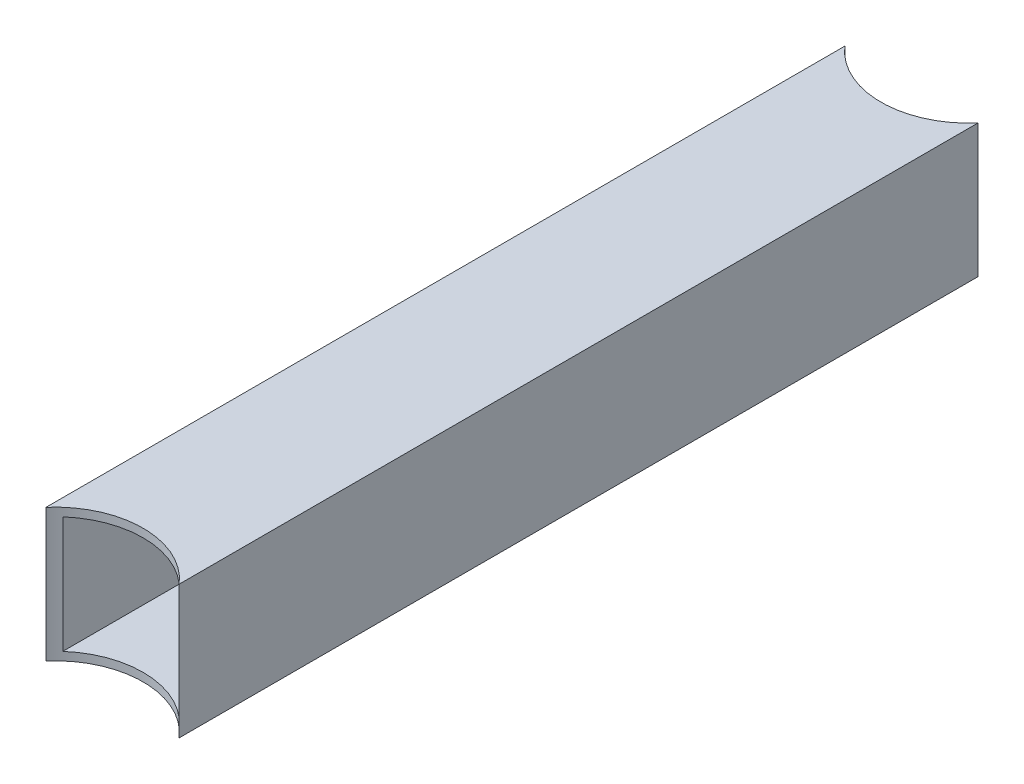
ISO-10303-21;
HEADER;
FILE_DESCRIPTION(('STEP AP214'),'2;1');
FILE_NAME('part.step','',(''),(''),'','','');
FILE_SCHEMA(('AUTOMOTIVE_DESIGN { 1 0 10303 214 1 1 1 1 }'));
ENDSEC;
DATA;
#1=APPLICATION_CONTEXT('core data for automotive mechanical design processes');
#2=APPLICATION_PROTOCOL_DEFINITION('international standard','automotive_design',2000,#1);
#3=PRODUCT_CONTEXT('',#1,'mechanical');
#4=PRODUCT('Part','Part','',(#3));
#5=PRODUCT_RELATED_PRODUCT_CATEGORY('part','',(#4));
#6=PRODUCT_DEFINITION_FORMATION('','',#4);
#7=PRODUCT_DEFINITION_CONTEXT('part definition',#1,'design');
#8=PRODUCT_DEFINITION('design','',#6,#7);
#9=PRODUCT_DEFINITION_SHAPE('','',#8);
#10=(LENGTH_UNIT() NAMED_UNIT(*) SI_UNIT(.MILLI.,.METRE.));
#11=(NAMED_UNIT(*) PLANE_ANGLE_UNIT() SI_UNIT($,.RADIAN.));
#12=(NAMED_UNIT(*) SI_UNIT($,.STERADIAN.) SOLID_ANGLE_UNIT());
#13=UNCERTAINTY_MEASURE_WITH_UNIT(LENGTH_MEASURE(1.E-05),#10,'distance_accuracy_value','');
#14=(GEOMETRIC_REPRESENTATION_CONTEXT(3) GLOBAL_UNCERTAINTY_ASSIGNED_CONTEXT((#13)) GLOBAL_UNIT_ASSIGNED_CONTEXT((#10,
#11,#12)) REPRESENTATION_CONTEXT('',''));
#15=CARTESIAN_POINT('',(0.,0.,0.));
#16=DIRECTION('',(0.,0.,1.));
#17=DIRECTION('',(1.,0.,0.));
#18=AXIS2_PLACEMENT_3D('',#15,#16,#17);
#19=CARTESIAN_POINT('',(12.7,12.7,152.4));
#20=DIRECTION('',(-1.,0.,0.));
#21=DIRECTION('',(0.,0.,1.));
#22=AXIS2_PLACEMENT_3D('',#19,#20,#21);
#23=PLANE('',#22);
#24=DIRECTION('',(0.,1.,0.));
#25=VECTOR('',#24,1.);
#26=CARTESIAN_POINT('',(12.7,12.7,0.));
#27=LINE('',#26,#25);
#28=CARTESIAN_POINT('',(12.7,-12.7,0.));
#29=VERTEX_POINT('',#28);
#30=CARTESIAN_POINT('',(12.7,12.7,0.));
#31=VERTEX_POINT('',#30);
#32=EDGE_CURVE('E128',#29,#31,#27,.T.);
#33=ORIENTED_EDGE('',*,*,#32,.T.);
#34=DIRECTION('',(0.,0.,-1.));
#35=VECTOR('',#34,1.);
#36=CARTESIAN_POINT('',(12.7,12.7,152.4));
#37=LINE('',#36,#35);
#38=CARTESIAN_POINT('',(12.7,12.7,152.4));
#39=VERTEX_POINT('',#38);
#40=EDGE_CURVE('E123',#39,#31,#37,.T.);
#41=ORIENTED_EDGE('',*,*,#40,.F.);
#42=DIRECTION('',(0.,1.,0.));
#43=VECTOR('',#42,1.);
#44=CARTESIAN_POINT('',(12.7,12.7,152.4));
#45=LINE('',#44,#43);
#46=CARTESIAN_POINT('',(12.7,-12.7,152.4));
#47=VERTEX_POINT('',#46);
#48=EDGE_CURVE('E102',#47,#39,#45,.T.);
#49=ORIENTED_EDGE('',*,*,#48,.F.);
#50=DIRECTION('',(0.,0.,-1.));
#51=VECTOR('',#50,1.);
#52=CARTESIAN_POINT('',(12.7,-12.7,152.4));
#53=LINE('',#52,#51);
#54=EDGE_CURVE('E114',#47,#29,#53,.T.);
#55=ORIENTED_EDGE('',*,*,#54,.T.);
#56=EDGE_LOOP('',(#33,#41,#49,#55));
#57=FACE_BOUND('',#56,.T.);
#58=ADVANCED_FACE('F34',(#57),#23,.F.);
#59=CARTESIAN_POINT('',(-12.7,12.7,152.4));
#60=DIRECTION('',(0.,-1.,0.));
#61=DIRECTION('',(0.,0.,-1.));
#62=AXIS2_PLACEMENT_3D('',#59,#60,#61);
#63=PLANE('',#62);
#64=DIRECTION('',(0.,0.,-1.));
#65=VECTOR('',#64,1.);
#66=CARTESIAN_POINT('',(-12.7,12.7,152.4));
#67=LINE('',#66,#65);
#68=CARTESIAN_POINT('',(-12.7,12.7,152.4));
#69=VERTEX_POINT('',#68);
#70=CARTESIAN_POINT('',(-12.7,12.7,0.));
#71=VERTEX_POINT('',#70);
#72=EDGE_CURVE('E136',#69,#71,#67,.T.);
#73=ORIENTED_EDGE('',*,*,#72,.F.);
#74=CARTESIAN_POINT('',(0.,12.7,163.342654888097));
#75=DIRECTION('',(0.,1.,0.));
#76=DIRECTION('',(0.,0.,-1.));
#77=AXIS2_PLACEMENT_3D('',#74,#75,#76);
#78=CIRCLE('',#77,16.764);
#79=EDGE_CURVE('E110',#39,#69,#78,.T.);
#80=ORIENTED_EDGE('',*,*,#79,.F.);
#81=ORIENTED_EDGE('',*,*,#40,.T.);
#82=CARTESIAN_POINT('',(0.,12.7,-10.9426548880973));
#83=DIRECTION('',(0.,1.,0.));
#84=DIRECTION('',(0.,0.,1.));
#85=AXIS2_PLACEMENT_3D('',#82,#83,#84);
#86=CIRCLE('',#85,16.764);
#87=EDGE_CURVE('E169',#71,#31,#86,.T.);
#88=ORIENTED_EDGE('',*,*,#87,.F.);
#89=EDGE_LOOP('',(#73,#80,#81,#88));
#90=FACE_BOUND('',#89,.T.);
#91=ADVANCED_FACE('F179',(#90),#63,.F.);
#92=CARTESIAN_POINT('',(-12.7,12.7,152.4));
#93=DIRECTION('',(1.,0.,0.));
#94=DIRECTION('',(0.,1.,0.));
#95=AXIS2_PLACEMENT_3D('',#92,#93,#94);
#96=PLANE('',#95);
#97=DIRECTION('',(0.,-1.,0.));
#98=VECTOR('',#97,1.);
#99=CARTESIAN_POINT('',(-12.7,12.7,0.));
#100=LINE('',#99,#98);
#101=CARTESIAN_POINT('',(-12.7,-12.7,0.));
#102=VERTEX_POINT('',#101);
#103=EDGE_CURVE('E124',#71,#102,#100,.T.);
#104=ORIENTED_EDGE('',*,*,#103,.T.);
#105=DIRECTION('',(0.,0.,-1.));
#106=VECTOR('',#105,1.);
#107=CARTESIAN_POINT('',(-12.7,-12.7,152.4));
#108=LINE('',#107,#106);
#109=CARTESIAN_POINT('',(-12.7,-12.7,152.4));
#110=VERTEX_POINT('',#109);
#111=EDGE_CURVE('E119',#110,#102,#108,.T.);
#112=ORIENTED_EDGE('',*,*,#111,.F.);
#113=DIRECTION('',(0.,-1.,0.));
#114=VECTOR('',#113,1.);
#115=CARTESIAN_POINT('',(-12.7,12.7,152.4));
#116=LINE('',#115,#114);
#117=EDGE_CURVE('E105',#69,#110,#116,.T.);
#118=ORIENTED_EDGE('',*,*,#117,.F.);
#119=ORIENTED_EDGE('',*,*,#72,.T.);
#120=EDGE_LOOP('',(#104,#112,#118,#119));
#121=FACE_BOUND('',#120,.T.);
#122=ADVANCED_FACE('F181',(#121),#96,.F.);
#123=CARTESIAN_POINT('',(-12.7,-12.7,152.4));
#124=DIRECTION('',(0.,1.,0.));
#125=DIRECTION('',(0.,0.,1.));
#126=AXIS2_PLACEMENT_3D('',#123,#124,#125);
#127=PLANE('',#126);
#128=ORIENTED_EDGE('',*,*,#54,.F.);
#129=CARTESIAN_POINT('',(0.,-12.7,163.342654888097));
#130=DIRECTION('',(0.,1.,0.));
#131=DIRECTION('',(0.,0.,-1.));
#132=AXIS2_PLACEMENT_3D('',#129,#130,#131);
#133=CIRCLE('',#132,16.764);
#134=EDGE_CURVE('E98',#47,#110,#133,.T.);
#135=ORIENTED_EDGE('',*,*,#134,.T.);
#136=ORIENTED_EDGE('',*,*,#111,.T.);
#137=CARTESIAN_POINT('',(0.,-12.7,-10.9426548880973));
#138=DIRECTION('',(0.,1.,0.));
#139=DIRECTION('',(0.,0.,1.));
#140=AXIS2_PLACEMENT_3D('',#137,#138,#139);
#141=CIRCLE('',#140,16.764);
#142=EDGE_CURVE('E116',#102,#29,#141,.T.);
#143=ORIENTED_EDGE('',*,*,#142,.T.);
#144=EDGE_LOOP('',(#128,#135,#136,#143));
#145=FACE_BOUND('',#144,.T.);
#146=ADVANCED_FACE('F115',(#145),#127,.F.);
#147=CARTESIAN_POINT('',(-11.1125,-11.1125,152.4));
#148=DIRECTION('',(1.,0.,0.));
#149=DIRECTION('',(0.,0.,-1.));
#150=AXIS2_PLACEMENT_3D('',#147,#148,#149);
#151=PLANE('',#150);
#152=DIRECTION('',(0.,1.,0.));
#153=VECTOR('',#152,1.);
#154=CARTESIAN_POINT('',(-11.1125,-12.7,150.791000027084));
#155=LINE('',#154,#153);
#156=CARTESIAN_POINT('',(-11.1125,-11.1125,150.791000027084));
#157=VERTEX_POINT('',#156);
#158=CARTESIAN_POINT('',(-11.1125,11.1125,150.791000027084));
#159=VERTEX_POINT('',#158);
#160=EDGE_CURVE('E47',#157,#159,#155,.T.);
#161=ORIENTED_EDGE('',*,*,#160,.F.);
#162=DIRECTION('',(0.,0.,-1.));
#163=VECTOR('',#162,1.);
#164=CARTESIAN_POINT('',(-11.1125,-11.1125,152.4));
#165=LINE('',#164,#163);
#166=CARTESIAN_POINT('',(-11.1125,-11.1125,1.60899997291603));
#167=VERTEX_POINT('',#166);
#168=EDGE_CURVE('E131',#157,#167,#165,.T.);
#169=ORIENTED_EDGE('',*,*,#168,.T.);
#170=DIRECTION('',(0.,1.,0.));
#171=VECTOR('',#170,1.);
#172=CARTESIAN_POINT('',(-11.1125,-12.7,1.60899997291603));
#173=LINE('',#172,#171);
#174=CARTESIAN_POINT('',(-11.1125,11.1125,1.60899997291603));
#175=VERTEX_POINT('',#174);
#176=EDGE_CURVE('E147',#175,#167,#173,.F.);
#177=ORIENTED_EDGE('',*,*,#176,.F.);
#178=DIRECTION('',(0.,0.,-1.));
#179=VECTOR('',#178,1.);
#180=CARTESIAN_POINT('',(-11.1125,11.1125,152.4));
#181=LINE('',#180,#179);
#182=EDGE_CURVE('E154',#159,#175,#181,.T.);
#183=ORIENTED_EDGE('',*,*,#182,.F.);
#184=EDGE_LOOP('',(#161,#169,#177,#183));
#185=FACE_BOUND('',#184,.T.);
#186=ADVANCED_FACE('F153',(#185),#151,.T.);
#187=CARTESIAN_POINT('',(11.1125,-11.1125,152.4));
#188=DIRECTION('',(0.,1.,0.));
#189=DIRECTION('',(0.,0.,1.));
#190=AXIS2_PLACEMENT_3D('',#187,#188,#189);
#191=PLANE('',#190);
#192=CARTESIAN_POINT('',(0.,-11.1125,163.342654888097));
#193=DIRECTION('',(0.,1.,0.));
#194=DIRECTION('',(0.,0.,1.));
#195=AXIS2_PLACEMENT_3D('',#192,#193,#194);
#196=CIRCLE('',#195,16.764);
#197=CARTESIAN_POINT('',(11.1125,-11.1125,150.791000027084));
#198=VERTEX_POINT('',#197);
#199=EDGE_CURVE('E167',#198,#157,#196,.T.);
#200=ORIENTED_EDGE('',*,*,#199,.F.);
#201=DIRECTION('',(0.,0.,-1.));
#202=VECTOR('',#201,1.);
#203=CARTESIAN_POINT('',(11.1125,-11.1125,152.4));
#204=LINE('',#203,#202);
#205=CARTESIAN_POINT('',(11.1125,-11.1125,1.60899997291603));
#206=VERTEX_POINT('',#205);
#207=EDGE_CURVE('E162',#198,#206,#204,.T.);
#208=ORIENTED_EDGE('',*,*,#207,.T.);
#209=CARTESIAN_POINT('',(0.,-11.1125,-10.9426548880973));
#210=DIRECTION('',(0.,1.,0.));
#211=DIRECTION('',(0.,0.,1.));
#212=AXIS2_PLACEMENT_3D('',#209,#210,#211);
#213=CIRCLE('',#212,16.764);
#214=EDGE_CURVE('E156',#167,#206,#213,.T.);
#215=ORIENTED_EDGE('',*,*,#214,.F.);
#216=ORIENTED_EDGE('',*,*,#168,.F.);
#217=EDGE_LOOP('',(#200,#208,#215,#216));
#218=FACE_BOUND('',#217,.T.);
#219=ADVANCED_FACE('F166',(#218),#191,.T.);
#220=CARTESIAN_POINT('',(11.1125,-11.1125,152.4));
#221=DIRECTION('',(-1.,0.,0.));
#222=DIRECTION('',(0.,0.,1.));
#223=AXIS2_PLACEMENT_3D('',#220,#221,#222);
#224=PLANE('',#223);
#225=DIRECTION('',(0.,1.,0.));
#226=VECTOR('',#225,1.);
#227=CARTESIAN_POINT('',(11.1125,-12.7,150.791000027084));
#228=LINE('',#227,#226);
#229=CARTESIAN_POINT('',(11.1125,11.1125,150.791000027084));
#230=VERTEX_POINT('',#229);
#231=EDGE_CURVE('E109',#230,#198,#228,.F.);
#232=ORIENTED_EDGE('',*,*,#231,.F.);
#233=DIRECTION('',(0.,0.,-1.));
#234=VECTOR('',#233,1.);
#235=CARTESIAN_POINT('',(11.1125,11.1125,152.4));
#236=LINE('',#235,#234);
#237=CARTESIAN_POINT('',(11.1125,11.1125,1.60899997291603));
#238=VERTEX_POINT('',#237);
#239=EDGE_CURVE('E55',#230,#238,#236,.T.);
#240=ORIENTED_EDGE('',*,*,#239,.T.);
#241=DIRECTION('',(0.,1.,0.));
#242=VECTOR('',#241,1.);
#243=CARTESIAN_POINT('',(11.1125,-12.7,1.60899997291603));
#244=LINE('',#243,#242);
#245=EDGE_CURVE('E149',#206,#238,#244,.T.);
#246=ORIENTED_EDGE('',*,*,#245,.F.);
#247=ORIENTED_EDGE('',*,*,#207,.F.);
#248=EDGE_LOOP('',(#232,#240,#246,#247));
#249=FACE_BOUND('',#248,.T.);
#250=ADVANCED_FACE('F168',(#249),#224,.T.);
#251=CARTESIAN_POINT('',(11.1125,11.1125,152.4));
#252=DIRECTION('',(0.,-1.,0.));
#253=DIRECTION('',(0.,0.,-1.));
#254=AXIS2_PLACEMENT_3D('',#251,#252,#253);
#255=PLANE('',#254);
#256=CARTESIAN_POINT('',(0.,11.1125,163.342654888097));
#257=DIRECTION('',(0.,-1.,0.));
#258=DIRECTION('',(0.,0.,-1.));
#259=AXIS2_PLACEMENT_3D('',#256,#257,#258);
#260=CIRCLE('',#259,16.764);
#261=EDGE_CURVE('E11',#159,#230,#260,.T.);
#262=ORIENTED_EDGE('',*,*,#261,.F.);
#263=ORIENTED_EDGE('',*,*,#182,.T.);
#264=CARTESIAN_POINT('',(0.,11.1125,-10.9426548880973));
#265=DIRECTION('',(0.,-1.,0.));
#266=DIRECTION('',(0.,0.,-1.));
#267=AXIS2_PLACEMENT_3D('',#264,#265,#266);
#268=CIRCLE('',#267,16.764);
#269=EDGE_CURVE('E41',#238,#175,#268,.T.);
#270=ORIENTED_EDGE('',*,*,#269,.F.);
#271=ORIENTED_EDGE('',*,*,#239,.F.);
#272=EDGE_LOOP('',(#262,#263,#270,#271));
#273=FACE_BOUND('',#272,.T.);
#274=ADVANCED_FACE('F183',(#273),#255,.T.);
#275=CARTESIAN_POINT('',(0.,-12.7,-10.9426548880973));
#276=DIRECTION('',(0.,1.,0.));
#277=DIRECTION('',(0.,0.,1.));
#278=AXIS2_PLACEMENT_3D('',#275,#276,#277);
#279=CYLINDRICAL_SURFACE('',#278,16.764);
#280=ORIENTED_EDGE('',*,*,#176,.T.);
#281=ORIENTED_EDGE('',*,*,#214,.T.);
#282=ORIENTED_EDGE('',*,*,#245,.T.);
#283=ORIENTED_EDGE('',*,*,#269,.T.);
#284=EDGE_LOOP('',(#280,#281,#282,#283));
#285=FACE_BOUND('',#284,.T.);
#286=ORIENTED_EDGE('',*,*,#87,.T.);
#287=ORIENTED_EDGE('',*,*,#32,.F.);
#288=ORIENTED_EDGE('',*,*,#142,.F.);
#289=ORIENTED_EDGE('',*,*,#103,.F.);
#290=EDGE_LOOP('',(#286,#287,#288,#289));
#291=FACE_BOUND('',#290,.T.);
#292=ADVANCED_FACE('F144',(#285,#291),#279,.F.);
#293=CARTESIAN_POINT('',(0.,-12.7,163.342654888097));
#294=DIRECTION('',(0.,1.,0.));
#295=DIRECTION('',(0.,0.,1.));
#296=AXIS2_PLACEMENT_3D('',#293,#294,#295);
#297=CYLINDRICAL_SURFACE('',#296,16.764);
#298=ORIENTED_EDGE('',*,*,#160,.T.);
#299=ORIENTED_EDGE('',*,*,#261,.T.);
#300=ORIENTED_EDGE('',*,*,#231,.T.);
#301=ORIENTED_EDGE('',*,*,#199,.T.);
#302=EDGE_LOOP('',(#298,#299,#300,#301));
#303=FACE_BOUND('',#302,.T.);
#304=ORIENTED_EDGE('',*,*,#79,.T.);
#305=ORIENTED_EDGE('',*,*,#117,.T.);
#306=ORIENTED_EDGE('',*,*,#134,.F.);
#307=ORIENTED_EDGE('',*,*,#48,.T.);
#308=EDGE_LOOP('',(#304,#305,#306,#307));
#309=FACE_BOUND('',#308,.T.);
#310=ADVANCED_FACE('F100',(#303,#309),#297,.F.);
#311=CLOSED_SHELL('',(#58,#91,#122,#146,#186,#219,#250,#274,#292,#310));
#312=MANIFOLD_SOLID_BREP('B2',#311);
#313=ADVANCED_BREP_SHAPE_REPRESENTATION('',(#18,#312),#14);
#314=SHAPE_DEFINITION_REPRESENTATION(#9,#313);
ENDSEC;
END-ISO-10303-21;
